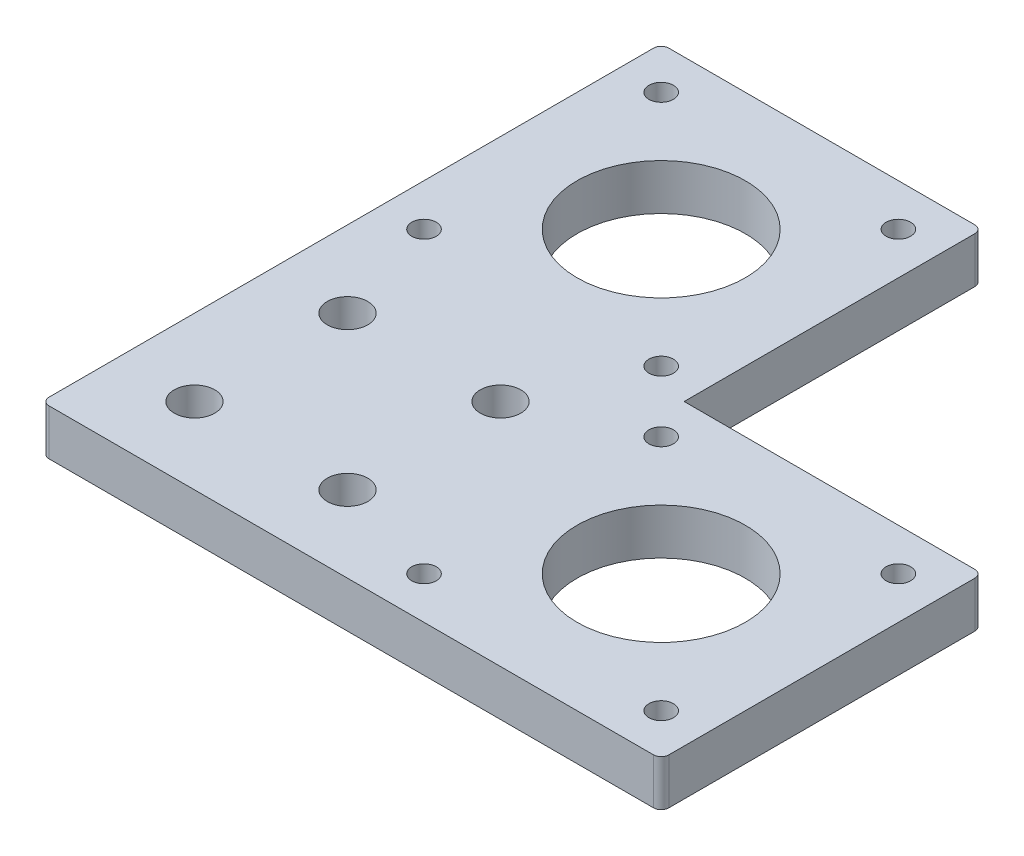
ISO-10303-21;
HEADER;
FILE_DESCRIPTION(('STEP AP214'),'2;1');
FILE_NAME('part.step','',(''),(''),'','','');
FILE_SCHEMA(('AUTOMOTIVE_DESIGN { 1 0 10303 214 1 1 1 1 }'));
ENDSEC;
DATA;
#1=APPLICATION_CONTEXT('core data for automotive mechanical design processes');
#2=APPLICATION_PROTOCOL_DEFINITION('international standard','automotive_design',2000,#1);
#3=PRODUCT_CONTEXT('',#1,'mechanical');
#4=PRODUCT('Part','Part','',(#3));
#5=PRODUCT_RELATED_PRODUCT_CATEGORY('part','',(#4));
#6=PRODUCT_DEFINITION_FORMATION('','',#4);
#7=PRODUCT_DEFINITION_CONTEXT('part definition',#1,'design');
#8=PRODUCT_DEFINITION('design','',#6,#7);
#9=PRODUCT_DEFINITION_SHAPE('','',#8);
#10=(LENGTH_UNIT() NAMED_UNIT(*) SI_UNIT(.MILLI.,.METRE.));
#11=(NAMED_UNIT(*) PLANE_ANGLE_UNIT() SI_UNIT($,.RADIAN.));
#12=(NAMED_UNIT(*) SI_UNIT($,.STERADIAN.) SOLID_ANGLE_UNIT());
#13=UNCERTAINTY_MEASURE_WITH_UNIT(LENGTH_MEASURE(1.E-05),#10,'distance_accuracy_value','');
#14=(GEOMETRIC_REPRESENTATION_CONTEXT(3) GLOBAL_UNCERTAINTY_ASSIGNED_CONTEXT((#13)) GLOBAL_UNIT_ASSIGNED_CONTEXT((#10,
#11,#12)) REPRESENTATION_CONTEXT('',''));
#15=CARTESIAN_POINT('',(0.,0.,0.));
#16=DIRECTION('',(0.,0.,1.));
#17=DIRECTION('',(1.,0.,0.));
#18=AXIS2_PLACEMENT_3D('',#15,#16,#17);
#19=CARTESIAN_POINT('',(0.,6.,-81.));
#20=DIRECTION('',(1.,0.,0.));
#21=DIRECTION('',(0.,0.,-1.));
#22=AXIS2_PLACEMENT_3D('',#19,#20,#21);
#23=PLANE('',#22);
#24=DIRECTION('',(0.,0.,1.));
#25=VECTOR('',#24,1.);
#26=CARTESIAN_POINT('',(0.,6.,-81.));
#27=LINE('',#26,#25);
#28=CARTESIAN_POINT('',(0.,6.,-80.));
#29=VERTEX_POINT('',#28);
#30=CARTESIAN_POINT('',(0.,6.,-1.));
#31=VERTEX_POINT('',#30);
#32=EDGE_CURVE('E160',#29,#31,#27,.T.);
#33=ORIENTED_EDGE('',*,*,#32,.F.);
#34=DIRECTION('',(0.,-1.,0.));
#35=VECTOR('',#34,1.);
#36=CARTESIAN_POINT('',(0.,6.,-80.));
#37=LINE('',#36,#35);
#38=CARTESIAN_POINT('',(0.,0.,-80.));
#39=VERTEX_POINT('',#38);
#40=EDGE_CURVE('E163',#29,#39,#37,.T.);
#41=ORIENTED_EDGE('',*,*,#40,.T.);
#42=DIRECTION('',(0.,0.,1.));
#43=VECTOR('',#42,1.);
#44=CARTESIAN_POINT('',(0.,0.,-81.));
#45=LINE('',#44,#43);
#46=CARTESIAN_POINT('',(0.,0.,-1.));
#47=VERTEX_POINT('',#46);
#48=EDGE_CURVE('E145',#39,#47,#45,.T.);
#49=ORIENTED_EDGE('',*,*,#48,.T.);
#50=DIRECTION('',(0.,-1.,0.));
#51=VECTOR('',#50,1.);
#52=CARTESIAN_POINT('',(0.,6.,-1.));
#53=LINE('',#52,#51);
#54=EDGE_CURVE('E137',#47,#31,#53,.F.);
#55=ORIENTED_EDGE('',*,*,#54,.T.);
#56=EDGE_LOOP('',(#33,#41,#49,#55));
#57=FACE_BOUND('',#56,.T.);
#58=ADVANCED_FACE('F38',(#57),#23,.F.);
#59=CARTESIAN_POINT('',(0.,6.,0.));
#60=DIRECTION('',(0.,0.,-1.));
#61=DIRECTION('',(-1.,0.,0.));
#62=AXIS2_PLACEMENT_3D('',#59,#60,#61);
#63=PLANE('',#62);
#64=DIRECTION('',(1.,0.,0.));
#65=VECTOR('',#64,1.);
#66=CARTESIAN_POINT('',(0.,0.,0.));
#67=LINE('',#66,#65);
#68=CARTESIAN_POINT('',(1.,0.,0.));
#69=VERTEX_POINT('',#68);
#70=CARTESIAN_POINT('',(80.,0.,0.));
#71=VERTEX_POINT('',#70);
#72=EDGE_CURVE('E148',#69,#71,#67,.T.);
#73=ORIENTED_EDGE('',*,*,#72,.T.);
#74=DIRECTION('',(0.,-1.,0.));
#75=VECTOR('',#74,1.);
#76=CARTESIAN_POINT('',(80.,6.,0.));
#77=LINE('',#76,#75);
#78=CARTESIAN_POINT('',(80.,6.,0.));
#79=VERTEX_POINT('',#78);
#80=EDGE_CURVE('E11',#71,#79,#77,.F.);
#81=ORIENTED_EDGE('',*,*,#80,.T.);
#82=DIRECTION('',(1.,0.,0.));
#83=VECTOR('',#82,1.);
#84=CARTESIAN_POINT('',(0.,6.,0.));
#85=LINE('',#84,#83);
#86=CARTESIAN_POINT('',(1.,6.,0.));
#87=VERTEX_POINT('',#86);
#88=EDGE_CURVE('E205',#87,#79,#85,.T.);
#89=ORIENTED_EDGE('',*,*,#88,.F.);
#90=DIRECTION('',(0.,-1.,0.));
#91=VECTOR('',#90,1.);
#92=CARTESIAN_POINT('',(1.,6.,0.));
#93=LINE('',#92,#91);
#94=EDGE_CURVE('E46',#87,#69,#93,.T.);
#95=ORIENTED_EDGE('',*,*,#94,.T.);
#96=EDGE_LOOP('',(#73,#81,#89,#95));
#97=FACE_BOUND('',#96,.T.);
#98=ADVANCED_FACE('F202',(#97),#63,.F.);
#99=CARTESIAN_POINT('',(81.,6.,0.));
#100=DIRECTION('',(-1.,0.,0.));
#101=DIRECTION('',(0.,0.,1.));
#102=AXIS2_PLACEMENT_3D('',#99,#100,#101);
#103=PLANE('',#102);
#104=DIRECTION('',(0.,0.,-1.));
#105=VECTOR('',#104,1.);
#106=CARTESIAN_POINT('',(81.,0.,0.));
#107=LINE('',#106,#105);
#108=CARTESIAN_POINT('',(81.,0.,-1.00000000000001));
#109=VERTEX_POINT('',#108);
#110=CARTESIAN_POINT('',(81.,0.,-41.));
#111=VERTEX_POINT('',#110);
#112=EDGE_CURVE('E152',#109,#111,#107,.T.);
#113=ORIENTED_EDGE('',*,*,#112,.T.);
#114=DIRECTION('',(0.,-1.,0.));
#115=VECTOR('',#114,1.);
#116=CARTESIAN_POINT('',(81.,6.,-41.));
#117=LINE('',#116,#115);
#118=CARTESIAN_POINT('',(81.,6.,-41.));
#119=VERTEX_POINT('',#118);
#120=EDGE_CURVE('E196',#111,#119,#117,.F.);
#121=ORIENTED_EDGE('',*,*,#120,.T.);
#122=DIRECTION('',(0.,0.,-1.));
#123=VECTOR('',#122,1.);
#124=CARTESIAN_POINT('',(81.,6.,0.));
#125=LINE('',#124,#123);
#126=CARTESIAN_POINT('',(81.,6.,-1.00000000000001));
#127=VERTEX_POINT('',#126);
#128=EDGE_CURVE('E129',#127,#119,#125,.T.);
#129=ORIENTED_EDGE('',*,*,#128,.F.);
#130=DIRECTION('',(0.,-1.,0.));
#131=VECTOR('',#130,1.);
#132=CARTESIAN_POINT('',(81.,6.,-1.00000000000001));
#133=LINE('',#132,#131);
#134=EDGE_CURVE('E193',#127,#109,#133,.T.);
#135=ORIENTED_EDGE('',*,*,#134,.T.);
#136=EDGE_LOOP('',(#113,#121,#129,#135));
#137=FACE_BOUND('',#136,.T.);
#138=ADVANCED_FACE('F218',(#137),#103,.F.);
#139=CARTESIAN_POINT('',(81.,6.,-42.));
#140=DIRECTION('',(0.,0.,1.));
#141=DIRECTION('',(1.,0.,0.));
#142=AXIS2_PLACEMENT_3D('',#139,#140,#141);
#143=PLANE('',#142);
#144=DIRECTION('',(-1.,0.,0.));
#145=VECTOR('',#144,1.);
#146=CARTESIAN_POINT('',(81.,6.,-42.));
#147=LINE('',#146,#145);
#148=CARTESIAN_POINT('',(80.,6.,-42.));
#149=VERTEX_POINT('',#148);
#150=CARTESIAN_POINT('',(42.,6.,-42.));
#151=VERTEX_POINT('',#150);
#152=EDGE_CURVE('E120',#149,#151,#147,.T.);
#153=ORIENTED_EDGE('',*,*,#152,.F.);
#154=DIRECTION('',(0.,-1.,0.));
#155=VECTOR('',#154,1.);
#156=CARTESIAN_POINT('',(80.,6.,-42.));
#157=LINE('',#156,#155);
#158=CARTESIAN_POINT('',(80.,0.,-42.));
#159=VERTEX_POINT('',#158);
#160=EDGE_CURVE('E191',#149,#159,#157,.T.);
#161=ORIENTED_EDGE('',*,*,#160,.T.);
#162=DIRECTION('',(-1.,0.,0.));
#163=VECTOR('',#162,1.);
#164=CARTESIAN_POINT('',(81.,0.,-42.));
#165=LINE('',#164,#163);
#166=CARTESIAN_POINT('',(42.,0.,-42.));
#167=VERTEX_POINT('',#166);
#168=EDGE_CURVE('E135',#159,#167,#165,.T.);
#169=ORIENTED_EDGE('',*,*,#168,.T.);
#170=DIRECTION('',(0.,-1.,0.));
#171=VECTOR('',#170,1.);
#172=CARTESIAN_POINT('',(42.,6.,-42.));
#173=LINE('',#172,#171);
#174=EDGE_CURVE('E132',#151,#167,#173,.T.);
#175=ORIENTED_EDGE('',*,*,#174,.F.);
#176=EDGE_LOOP('',(#153,#161,#169,#175));
#177=FACE_BOUND('',#176,.T.);
#178=ADVANCED_FACE('F133',(#177),#143,.F.);
#179=CARTESIAN_POINT('',(42.,6.,-42.));
#180=DIRECTION('',(-1.,0.,0.));
#181=DIRECTION('',(0.,0.,1.));
#182=AXIS2_PLACEMENT_3D('',#179,#180,#181);
#183=PLANE('',#182);
#184=DIRECTION('',(0.,0.,-1.));
#185=VECTOR('',#184,1.);
#186=CARTESIAN_POINT('',(42.,0.,-42.));
#187=LINE('',#186,#185);
#188=CARTESIAN_POINT('',(42.,0.,-80.));
#189=VERTEX_POINT('',#188);
#190=EDGE_CURVE('E156',#167,#189,#187,.T.);
#191=ORIENTED_EDGE('',*,*,#190,.T.);
#192=DIRECTION('',(0.,-1.,0.));
#193=VECTOR('',#192,1.);
#194=CARTESIAN_POINT('',(42.,6.,-80.));
#195=LINE('',#194,#193);
#196=CARTESIAN_POINT('',(42.,6.,-80.));
#197=VERTEX_POINT('',#196);
#198=EDGE_CURVE('E53',#189,#197,#195,.F.);
#199=ORIENTED_EDGE('',*,*,#198,.T.);
#200=DIRECTION('',(0.,0.,-1.));
#201=VECTOR('',#200,1.);
#202=CARTESIAN_POINT('',(42.,6.,-42.));
#203=LINE('',#202,#201);
#204=EDGE_CURVE('E124',#151,#197,#203,.T.);
#205=ORIENTED_EDGE('',*,*,#204,.F.);
#206=ORIENTED_EDGE('',*,*,#174,.T.);
#207=EDGE_LOOP('',(#191,#199,#205,#206));
#208=FACE_BOUND('',#207,.T.);
#209=ADVANCED_FACE('F140',(#208),#183,.F.);
#210=CARTESIAN_POINT('',(42.,6.,-81.));
#211=DIRECTION('',(0.,0.,1.));
#212=DIRECTION('',(1.,0.,0.));
#213=AXIS2_PLACEMENT_3D('',#210,#211,#212);
#214=PLANE('',#213);
#215=DIRECTION('',(-1.,0.,0.));
#216=VECTOR('',#215,1.);
#217=CARTESIAN_POINT('',(42.,0.,-81.));
#218=LINE('',#217,#216);
#219=CARTESIAN_POINT('',(41.,0.,-81.));
#220=VERTEX_POINT('',#219);
#221=CARTESIAN_POINT('',(1.00000000000001,0.,-81.));
#222=VERTEX_POINT('',#221);
#223=EDGE_CURVE('E158',#220,#222,#218,.T.);
#224=ORIENTED_EDGE('',*,*,#223,.T.);
#225=DIRECTION('',(0.,-1.,0.));
#226=VECTOR('',#225,1.);
#227=CARTESIAN_POINT('',(1.,6.,-81.));
#228=LINE('',#227,#226);
#229=CARTESIAN_POINT('',(1.00000000000001,6.,-81.));
#230=VERTEX_POINT('',#229);
#231=EDGE_CURVE('E179',#222,#230,#228,.F.);
#232=ORIENTED_EDGE('',*,*,#231,.T.);
#233=DIRECTION('',(-1.,0.,0.));
#234=VECTOR('',#233,1.);
#235=CARTESIAN_POINT('',(42.,6.,-81.));
#236=LINE('',#235,#234);
#237=CARTESIAN_POINT('',(41.,6.,-81.));
#238=VERTEX_POINT('',#237);
#239=EDGE_CURVE('E138',#238,#230,#236,.T.);
#240=ORIENTED_EDGE('',*,*,#239,.F.);
#241=DIRECTION('',(0.,-1.,0.));
#242=VECTOR('',#241,1.);
#243=CARTESIAN_POINT('',(41.,6.,-81.));
#244=LINE('',#243,#242);
#245=EDGE_CURVE('E176',#238,#220,#244,.T.);
#246=ORIENTED_EDGE('',*,*,#245,.T.);
#247=EDGE_LOOP('',(#224,#232,#240,#246));
#248=FACE_BOUND('',#247,.T.);
#249=ADVANCED_FACE('F312',(#248),#214,.F.);
#250=CARTESIAN_POINT('',(0.,6.,0.));
#251=DIRECTION('',(0.,1.,0.));
#252=DIRECTION('',(0.,0.,1.));
#253=AXIS2_PLACEMENT_3D('',#250,#251,#252);
#254=PLANE('',#253);
#255=CARTESIAN_POINT('',(60.,6.,-21.));
#256=DIRECTION('',(0.,1.,0.));
#257=DIRECTION('',(0.,0.,1.));
#258=AXIS2_PLACEMENT_3D('',#255,#256,#257);
#259=CIRCLE('',#258,11.);
#260=CARTESIAN_POINT('',(60.,6.,-10.));
#261=VERTEX_POINT('',#260);
#262=EDGE_CURVE('E304',#261,#261,#259,.T.);
#263=ORIENTED_EDGE('',*,*,#262,.F.);
#264=EDGE_LOOP('',(#263));
#265=FACE_BOUND('',#264,.T.);
#266=CARTESIAN_POINT('',(21.,6.,-60.));
#267=DIRECTION('',(0.,1.,0.));
#268=DIRECTION('',(0.,0.,1.));
#269=AXIS2_PLACEMENT_3D('',#266,#267,#268);
#270=CIRCLE('',#269,11.);
#271=CARTESIAN_POINT('',(21.,6.,-49.));
#272=VERTEX_POINT('',#271);
#273=EDGE_CURVE('E298',#272,#272,#270,.T.);
#274=ORIENTED_EDGE('',*,*,#273,.F.);
#275=EDGE_LOOP('',(#274));
#276=FACE_BOUND('',#275,.T.);
#277=CARTESIAN_POINT('',(5.50000000000001,6.,-44.5));
#278=DIRECTION('',(0.,1.,0.));
#279=DIRECTION('',(0.,0.,1.));
#280=AXIS2_PLACEMENT_3D('',#277,#278,#279);
#281=CIRCLE('',#280,1.6);
#282=CARTESIAN_POINT('',(5.50000000000001,6.,-42.9));
#283=VERTEX_POINT('',#282);
#284=EDGE_CURVE('E292',#283,#283,#281,.T.);
#285=ORIENTED_EDGE('',*,*,#284,.F.);
#286=EDGE_LOOP('',(#285));
#287=FACE_BOUND('',#286,.T.);
#288=CARTESIAN_POINT('',(36.5,6.,-44.5));
#289=DIRECTION('',(0.,1.,0.));
#290=DIRECTION('',(0.,0.,1.));
#291=AXIS2_PLACEMENT_3D('',#288,#289,#290);
#292=CIRCLE('',#291,1.6);
#293=CARTESIAN_POINT('',(36.5,6.,-42.9));
#294=VERTEX_POINT('',#293);
#295=EDGE_CURVE('E286',#294,#294,#292,.T.);
#296=ORIENTED_EDGE('',*,*,#295,.F.);
#297=EDGE_LOOP('',(#296));
#298=FACE_BOUND('',#297,.T.);
#299=CARTESIAN_POINT('',(36.5,6.,-75.5));
#300=DIRECTION('',(0.,1.,0.));
#301=DIRECTION('',(0.,0.,1.));
#302=AXIS2_PLACEMENT_3D('',#299,#300,#301);
#303=CIRCLE('',#302,1.6);
#304=CARTESIAN_POINT('',(36.5,6.,-73.9));
#305=VERTEX_POINT('',#304);
#306=EDGE_CURVE('E280',#305,#305,#303,.T.);
#307=ORIENTED_EDGE('',*,*,#306,.F.);
#308=EDGE_LOOP('',(#307));
#309=FACE_BOUND('',#308,.T.);
#310=CARTESIAN_POINT('',(5.5,6.,-75.5));
#311=DIRECTION('',(0.,1.,0.));
#312=DIRECTION('',(0.,0.,1.));
#313=AXIS2_PLACEMENT_3D('',#310,#311,#312);
#314=CIRCLE('',#313,1.6);
#315=CARTESIAN_POINT('',(5.5,6.,-73.9));
#316=VERTEX_POINT('',#315);
#317=EDGE_CURVE('E274',#316,#316,#314,.T.);
#318=ORIENTED_EDGE('',*,*,#317,.F.);
#319=EDGE_LOOP('',(#318));
#320=FACE_BOUND('',#319,.T.);
#321=CARTESIAN_POINT('',(44.5,6.,-36.5));
#322=DIRECTION('',(0.,1.,0.));
#323=DIRECTION('',(0.,0.,1.));
#324=AXIS2_PLACEMENT_3D('',#321,#322,#323);
#325=CIRCLE('',#324,1.6);
#326=CARTESIAN_POINT('',(44.5,6.,-34.9));
#327=VERTEX_POINT('',#326);
#328=EDGE_CURVE('E268',#327,#327,#325,.T.);
#329=ORIENTED_EDGE('',*,*,#328,.F.);
#330=EDGE_LOOP('',(#329));
#331=FACE_BOUND('',#330,.T.);
#332=CARTESIAN_POINT('',(44.5,6.,-5.50000000000001));
#333=DIRECTION('',(0.,1.,0.));
#334=DIRECTION('',(0.,0.,1.));
#335=AXIS2_PLACEMENT_3D('',#332,#333,#334);
#336=CIRCLE('',#335,1.6);
#337=CARTESIAN_POINT('',(44.5,6.,-3.90000000000001));
#338=VERTEX_POINT('',#337);
#339=EDGE_CURVE('E262',#338,#338,#336,.T.);
#340=ORIENTED_EDGE('',*,*,#339,.F.);
#341=EDGE_LOOP('',(#340));
#342=FACE_BOUND('',#341,.T.);
#343=CARTESIAN_POINT('',(75.5,6.,-5.50000000000001));
#344=DIRECTION('',(0.,1.,0.));
#345=DIRECTION('',(0.,0.,1.));
#346=AXIS2_PLACEMENT_3D('',#343,#344,#345);
#347=CIRCLE('',#346,1.6);
#348=CARTESIAN_POINT('',(75.5,6.,-3.90000000000001));
#349=VERTEX_POINT('',#348);
#350=EDGE_CURVE('E256',#349,#349,#347,.T.);
#351=ORIENTED_EDGE('',*,*,#350,.F.);
#352=EDGE_LOOP('',(#351));
#353=FACE_BOUND('',#352,.T.);
#354=CARTESIAN_POINT('',(75.5,6.,-36.5));
#355=DIRECTION('',(0.,1.,0.));
#356=DIRECTION('',(0.,0.,1.));
#357=AXIS2_PLACEMENT_3D('',#354,#355,#356);
#358=CIRCLE('',#357,1.6);
#359=CARTESIAN_POINT('',(75.5,6.,-34.9));
#360=VERTEX_POINT('',#359);
#361=EDGE_CURVE('E250',#360,#360,#358,.T.);
#362=ORIENTED_EDGE('',*,*,#361,.F.);
#363=EDGE_LOOP('',(#362));
#364=FACE_BOUND('',#363,.T.);
#365=CARTESIAN_POINT('',(9.99999999999999,6.,-30.));
#366=DIRECTION('',(0.,1.,0.));
#367=DIRECTION('',(0.,0.,1.));
#368=AXIS2_PLACEMENT_3D('',#365,#366,#367);
#369=CIRCLE('',#368,2.65);
#370=CARTESIAN_POINT('',(9.99999999999999,6.,-27.35));
#371=VERTEX_POINT('',#370);
#372=EDGE_CURVE('E244',#371,#371,#369,.T.);
#373=ORIENTED_EDGE('',*,*,#372,.F.);
#374=EDGE_LOOP('',(#373));
#375=FACE_BOUND('',#374,.T.);
#376=CARTESIAN_POINT('',(30.,6.,-30.));
#377=DIRECTION('',(0.,1.,0.));
#378=DIRECTION('',(0.,0.,1.));
#379=AXIS2_PLACEMENT_3D('',#376,#377,#378);
#380=CIRCLE('',#379,2.65);
#381=CARTESIAN_POINT('',(30.,6.,-27.35));
#382=VERTEX_POINT('',#381);
#383=EDGE_CURVE('E238',#382,#382,#380,.T.);
#384=ORIENTED_EDGE('',*,*,#383,.F.);
#385=EDGE_LOOP('',(#384));
#386=FACE_BOUND('',#385,.T.);
#387=CARTESIAN_POINT('',(30.,6.,-10.));
#388=DIRECTION('',(0.,1.,0.));
#389=DIRECTION('',(0.,0.,1.));
#390=AXIS2_PLACEMENT_3D('',#387,#388,#389);
#391=CIRCLE('',#390,2.65);
#392=CARTESIAN_POINT('',(30.,6.,-7.35000000000001));
#393=VERTEX_POINT('',#392);
#394=EDGE_CURVE('E232',#393,#393,#391,.T.);
#395=ORIENTED_EDGE('',*,*,#394,.F.);
#396=EDGE_LOOP('',(#395));
#397=FACE_BOUND('',#396,.T.);
#398=CARTESIAN_POINT('',(9.99999999999999,6.,-10.));
#399=DIRECTION('',(0.,1.,0.));
#400=DIRECTION('',(0.,0.,1.));
#401=AXIS2_PLACEMENT_3D('',#398,#399,#400);
#402=CIRCLE('',#401,2.65);
#403=CARTESIAN_POINT('',(9.99999999999999,6.,-7.35));
#404=VERTEX_POINT('',#403);
#405=EDGE_CURVE('E226',#404,#404,#402,.T.);
#406=ORIENTED_EDGE('',*,*,#405,.F.);
#407=EDGE_LOOP('',(#406));
#408=FACE_BOUND('',#407,.T.);
#409=ORIENTED_EDGE('',*,*,#239,.T.);
#410=CARTESIAN_POINT('',(1.,6.,-80.));
#411=DIRECTION('',(0.,1.,0.));
#412=DIRECTION('',(0.,0.,1.));
#413=AXIS2_PLACEMENT_3D('',#410,#411,#412);
#414=CIRCLE('',#413,1.);
#415=EDGE_CURVE('E188',#230,#29,#414,.T.);
#416=ORIENTED_EDGE('',*,*,#415,.T.);
#417=ORIENTED_EDGE('',*,*,#32,.T.);
#418=CARTESIAN_POINT('',(1.,6.,-1.));
#419=DIRECTION('',(0.,1.,0.));
#420=DIRECTION('',(0.,0.,1.));
#421=AXIS2_PLACEMENT_3D('',#418,#419,#420);
#422=CIRCLE('',#421,1.);
#423=EDGE_CURVE('E181',#31,#87,#422,.T.);
#424=ORIENTED_EDGE('',*,*,#423,.T.);
#425=ORIENTED_EDGE('',*,*,#88,.T.);
#426=CARTESIAN_POINT('',(80.,6.,-1.00000000000001));
#427=DIRECTION('',(0.,1.,0.));
#428=DIRECTION('',(0.,0.,1.));
#429=AXIS2_PLACEMENT_3D('',#426,#427,#428);
#430=CIRCLE('',#429,1.);
#431=EDGE_CURVE('E183',#79,#127,#430,.T.);
#432=ORIENTED_EDGE('',*,*,#431,.T.);
#433=ORIENTED_EDGE('',*,*,#128,.T.);
#434=CARTESIAN_POINT('',(80.,6.,-41.));
#435=DIRECTION('',(0.,1.,0.));
#436=DIRECTION('',(0.,0.,1.));
#437=AXIS2_PLACEMENT_3D('',#434,#435,#436);
#438=CIRCLE('',#437,1.);
#439=EDGE_CURVE('E61',#119,#149,#438,.T.);
#440=ORIENTED_EDGE('',*,*,#439,.T.);
#441=ORIENTED_EDGE('',*,*,#152,.T.);
#442=ORIENTED_EDGE('',*,*,#204,.T.);
#443=CARTESIAN_POINT('',(41.,6.,-80.));
#444=DIRECTION('',(0.,1.,0.));
#445=DIRECTION('',(0.,0.,1.));
#446=AXIS2_PLACEMENT_3D('',#443,#444,#445);
#447=CIRCLE('',#446,1.);
#448=EDGE_CURVE('E186',#197,#238,#447,.T.);
#449=ORIENTED_EDGE('',*,*,#448,.T.);
#450=EDGE_LOOP('',(#409,#416,#417,#424,#425,#432,#433,#440,#441,#442,#449));
#451=FACE_BOUND('',#450,.T.);
#452=ADVANCED_FACE('F123',(#265,#276,#287,#298,#309,#320,#331,#342,#353,#364,#375,#386,#397,
#408,#451),#254,.T.);
#453=CARTESIAN_POINT('',(0.,0.,0.));
#454=DIRECTION('',(0.,1.,0.));
#455=DIRECTION('',(0.,0.,1.));
#456=AXIS2_PLACEMENT_3D('',#453,#454,#455);
#457=PLANE('',#456);
#458=CARTESIAN_POINT('',(60.,0.,-21.));
#459=DIRECTION('',(0.,1.,0.));
#460=DIRECTION('',(0.,0.,1.));
#461=AXIS2_PLACEMENT_3D('',#458,#459,#460);
#462=CIRCLE('',#461,11.);
#463=CARTESIAN_POINT('',(60.,0.,-10.));
#464=VERTEX_POINT('',#463);
#465=EDGE_CURVE('E301',#464,#464,#462,.T.);
#466=ORIENTED_EDGE('',*,*,#465,.T.);
#467=EDGE_LOOP('',(#466));
#468=FACE_BOUND('',#467,.T.);
#469=CARTESIAN_POINT('',(21.,0.,-60.));
#470=DIRECTION('',(0.,1.,0.));
#471=DIRECTION('',(0.,0.,1.));
#472=AXIS2_PLACEMENT_3D('',#469,#470,#471);
#473=CIRCLE('',#472,11.);
#474=CARTESIAN_POINT('',(21.,0.,-49.));
#475=VERTEX_POINT('',#474);
#476=EDGE_CURVE('E295',#475,#475,#473,.T.);
#477=ORIENTED_EDGE('',*,*,#476,.T.);
#478=EDGE_LOOP('',(#477));
#479=FACE_BOUND('',#478,.T.);
#480=CARTESIAN_POINT('',(5.50000000000001,0.,-44.5));
#481=DIRECTION('',(0.,1.,0.));
#482=DIRECTION('',(0.,0.,1.));
#483=AXIS2_PLACEMENT_3D('',#480,#481,#482);
#484=CIRCLE('',#483,1.6);
#485=CARTESIAN_POINT('',(5.50000000000001,0.,-42.9));
#486=VERTEX_POINT('',#485);
#487=EDGE_CURVE('E289',#486,#486,#484,.T.);
#488=ORIENTED_EDGE('',*,*,#487,.T.);
#489=EDGE_LOOP('',(#488));
#490=FACE_BOUND('',#489,.T.);
#491=CARTESIAN_POINT('',(36.5,0.,-44.5));
#492=DIRECTION('',(0.,1.,0.));
#493=DIRECTION('',(0.,0.,1.));
#494=AXIS2_PLACEMENT_3D('',#491,#492,#493);
#495=CIRCLE('',#494,1.6);
#496=CARTESIAN_POINT('',(36.5,0.,-42.9));
#497=VERTEX_POINT('',#496);
#498=EDGE_CURVE('E283',#497,#497,#495,.T.);
#499=ORIENTED_EDGE('',*,*,#498,.T.);
#500=EDGE_LOOP('',(#499));
#501=FACE_BOUND('',#500,.T.);
#502=CARTESIAN_POINT('',(36.5,0.,-75.5));
#503=DIRECTION('',(0.,1.,0.));
#504=DIRECTION('',(0.,0.,1.));
#505=AXIS2_PLACEMENT_3D('',#502,#503,#504);
#506=CIRCLE('',#505,1.6);
#507=CARTESIAN_POINT('',(36.5,0.,-73.9));
#508=VERTEX_POINT('',#507);
#509=EDGE_CURVE('E277',#508,#508,#506,.T.);
#510=ORIENTED_EDGE('',*,*,#509,.T.);
#511=EDGE_LOOP('',(#510));
#512=FACE_BOUND('',#511,.T.);
#513=CARTESIAN_POINT('',(5.5,0.,-75.5));
#514=DIRECTION('',(0.,1.,0.));
#515=DIRECTION('',(0.,0.,1.));
#516=AXIS2_PLACEMENT_3D('',#513,#514,#515);
#517=CIRCLE('',#516,1.6);
#518=CARTESIAN_POINT('',(5.5,0.,-73.9));
#519=VERTEX_POINT('',#518);
#520=EDGE_CURVE('E271',#519,#519,#517,.T.);
#521=ORIENTED_EDGE('',*,*,#520,.T.);
#522=EDGE_LOOP('',(#521));
#523=FACE_BOUND('',#522,.T.);
#524=CARTESIAN_POINT('',(44.5,0.,-36.5));
#525=DIRECTION('',(0.,1.,0.));
#526=DIRECTION('',(0.,0.,1.));
#527=AXIS2_PLACEMENT_3D('',#524,#525,#526);
#528=CIRCLE('',#527,1.6);
#529=CARTESIAN_POINT('',(44.5,0.,-34.9));
#530=VERTEX_POINT('',#529);
#531=EDGE_CURVE('E265',#530,#530,#528,.T.);
#532=ORIENTED_EDGE('',*,*,#531,.T.);
#533=EDGE_LOOP('',(#532));
#534=FACE_BOUND('',#533,.T.);
#535=CARTESIAN_POINT('',(44.5,0.,-5.50000000000001));
#536=DIRECTION('',(0.,1.,0.));
#537=DIRECTION('',(0.,0.,1.));
#538=AXIS2_PLACEMENT_3D('',#535,#536,#537);
#539=CIRCLE('',#538,1.6);
#540=CARTESIAN_POINT('',(44.5,0.,-3.90000000000001));
#541=VERTEX_POINT('',#540);
#542=EDGE_CURVE('E259',#541,#541,#539,.T.);
#543=ORIENTED_EDGE('',*,*,#542,.T.);
#544=EDGE_LOOP('',(#543));
#545=FACE_BOUND('',#544,.T.);
#546=CARTESIAN_POINT('',(75.5,0.,-5.50000000000001));
#547=DIRECTION('',(0.,1.,0.));
#548=DIRECTION('',(0.,0.,1.));
#549=AXIS2_PLACEMENT_3D('',#546,#547,#548);
#550=CIRCLE('',#549,1.6);
#551=CARTESIAN_POINT('',(75.5,0.,-3.90000000000001));
#552=VERTEX_POINT('',#551);
#553=EDGE_CURVE('E253',#552,#552,#550,.T.);
#554=ORIENTED_EDGE('',*,*,#553,.T.);
#555=EDGE_LOOP('',(#554));
#556=FACE_BOUND('',#555,.T.);
#557=CARTESIAN_POINT('',(75.5,0.,-36.5));
#558=DIRECTION('',(0.,1.,0.));
#559=DIRECTION('',(0.,0.,1.));
#560=AXIS2_PLACEMENT_3D('',#557,#558,#559);
#561=CIRCLE('',#560,1.6);
#562=CARTESIAN_POINT('',(75.5,0.,-34.9));
#563=VERTEX_POINT('',#562);
#564=EDGE_CURVE('E247',#563,#563,#561,.T.);
#565=ORIENTED_EDGE('',*,*,#564,.T.);
#566=EDGE_LOOP('',(#565));
#567=FACE_BOUND('',#566,.T.);
#568=CARTESIAN_POINT('',(9.99999999999999,0.,-30.));
#569=DIRECTION('',(0.,1.,0.));
#570=DIRECTION('',(0.,0.,1.));
#571=AXIS2_PLACEMENT_3D('',#568,#569,#570);
#572=CIRCLE('',#571,2.65);
#573=CARTESIAN_POINT('',(9.99999999999999,0.,-27.35));
#574=VERTEX_POINT('',#573);
#575=EDGE_CURVE('E241',#574,#574,#572,.T.);
#576=ORIENTED_EDGE('',*,*,#575,.T.);
#577=EDGE_LOOP('',(#576));
#578=FACE_BOUND('',#577,.T.);
#579=CARTESIAN_POINT('',(30.,0.,-30.));
#580=DIRECTION('',(0.,1.,0.));
#581=DIRECTION('',(0.,0.,1.));
#582=AXIS2_PLACEMENT_3D('',#579,#580,#581);
#583=CIRCLE('',#582,2.65);
#584=CARTESIAN_POINT('',(30.,0.,-27.35));
#585=VERTEX_POINT('',#584);
#586=EDGE_CURVE('E235',#585,#585,#583,.T.);
#587=ORIENTED_EDGE('',*,*,#586,.T.);
#588=EDGE_LOOP('',(#587));
#589=FACE_BOUND('',#588,.T.);
#590=CARTESIAN_POINT('',(30.,0.,-10.));
#591=DIRECTION('',(0.,1.,0.));
#592=DIRECTION('',(0.,0.,1.));
#593=AXIS2_PLACEMENT_3D('',#590,#591,#592);
#594=CIRCLE('',#593,2.65);
#595=CARTESIAN_POINT('',(30.,0.,-7.35000000000001));
#596=VERTEX_POINT('',#595);
#597=EDGE_CURVE('E229',#596,#596,#594,.T.);
#598=ORIENTED_EDGE('',*,*,#597,.T.);
#599=EDGE_LOOP('',(#598));
#600=FACE_BOUND('',#599,.T.);
#601=CARTESIAN_POINT('',(9.99999999999999,0.,-10.));
#602=DIRECTION('',(0.,1.,0.));
#603=DIRECTION('',(0.,0.,1.));
#604=AXIS2_PLACEMENT_3D('',#601,#602,#603);
#605=CIRCLE('',#604,2.65);
#606=CARTESIAN_POINT('',(9.99999999999999,0.,-7.35));
#607=VERTEX_POINT('',#606);
#608=EDGE_CURVE('E149',#607,#607,#605,.T.);
#609=ORIENTED_EDGE('',*,*,#608,.T.);
#610=EDGE_LOOP('',(#609));
#611=FACE_BOUND('',#610,.T.);
#612=ORIENTED_EDGE('',*,*,#48,.F.);
#613=CARTESIAN_POINT('',(1.,0.,-80.));
#614=DIRECTION('',(0.,1.,0.));
#615=DIRECTION('',(0.,0.,1.));
#616=AXIS2_PLACEMENT_3D('',#613,#614,#615);
#617=CIRCLE('',#616,1.);
#618=EDGE_CURVE('E174',#39,#222,#617,.F.);
#619=ORIENTED_EDGE('',*,*,#618,.T.);
#620=ORIENTED_EDGE('',*,*,#223,.F.);
#621=CARTESIAN_POINT('',(41.,0.,-80.));
#622=DIRECTION('',(0.,1.,0.));
#623=DIRECTION('',(0.,0.,1.));
#624=AXIS2_PLACEMENT_3D('',#621,#622,#623);
#625=CIRCLE('',#624,1.);
#626=EDGE_CURVE('E172',#220,#189,#625,.F.);
#627=ORIENTED_EDGE('',*,*,#626,.T.);
#628=ORIENTED_EDGE('',*,*,#190,.F.);
#629=ORIENTED_EDGE('',*,*,#168,.F.);
#630=CARTESIAN_POINT('',(80.,0.,-41.));
#631=DIRECTION('',(0.,1.,0.));
#632=DIRECTION('',(0.,0.,1.));
#633=AXIS2_PLACEMENT_3D('',#630,#631,#632);
#634=CIRCLE('',#633,1.);
#635=EDGE_CURVE('E170',#159,#111,#634,.F.);
#636=ORIENTED_EDGE('',*,*,#635,.T.);
#637=ORIENTED_EDGE('',*,*,#112,.F.);
#638=CARTESIAN_POINT('',(80.,0.,-1.00000000000001));
#639=DIRECTION('',(0.,1.,0.));
#640=DIRECTION('',(0.,0.,1.));
#641=AXIS2_PLACEMENT_3D('',#638,#639,#640);
#642=CIRCLE('',#641,1.);
#643=EDGE_CURVE('E168',#109,#71,#642,.F.);
#644=ORIENTED_EDGE('',*,*,#643,.T.);
#645=ORIENTED_EDGE('',*,*,#72,.F.);
#646=CARTESIAN_POINT('',(1.,0.,-1.));
#647=DIRECTION('',(0.,1.,0.));
#648=DIRECTION('',(0.,0.,1.));
#649=AXIS2_PLACEMENT_3D('',#646,#647,#648);
#650=CIRCLE('',#649,1.);
#651=EDGE_CURVE('E166',#69,#47,#650,.F.);
#652=ORIENTED_EDGE('',*,*,#651,.T.);
#653=EDGE_LOOP('',(#612,#619,#620,#627,#628,#629,#636,#637,#644,#645,#652));
#654=FACE_BOUND('',#653,.T.);
#655=ADVANCED_FACE('F210',(#468,#479,#490,#501,#512,#523,#534,#545,#556,#567,#578,#589,#600,
#611,#654),#457,.F.);
#656=CARTESIAN_POINT('',(9.99999999999999,6.,-10.));
#657=DIRECTION('',(0.,1.,0.));
#658=DIRECTION('',(0.,0.,1.));
#659=AXIS2_PLACEMENT_3D('',#656,#657,#658);
#660=CYLINDRICAL_SURFACE('',#659,2.65);
#661=ORIENTED_EDGE('',*,*,#608,.F.);
#662=EDGE_LOOP('',(#661));
#663=FACE_BOUND('',#662,.T.);
#664=ORIENTED_EDGE('',*,*,#405,.T.);
#665=EDGE_LOOP('',(#664));
#666=FACE_BOUND('',#665,.T.);
#667=ADVANCED_FACE('F340',(#663,#666),#660,.F.);
#668=CARTESIAN_POINT('',(30.,6.,-10.));
#669=DIRECTION('',(0.,1.,0.));
#670=DIRECTION('',(0.,0.,1.));
#671=AXIS2_PLACEMENT_3D('',#668,#669,#670);
#672=CYLINDRICAL_SURFACE('',#671,2.65);
#673=ORIENTED_EDGE('',*,*,#597,.F.);
#674=EDGE_LOOP('',(#673));
#675=FACE_BOUND('',#674,.T.);
#676=ORIENTED_EDGE('',*,*,#394,.T.);
#677=EDGE_LOOP('',(#676));
#678=FACE_BOUND('',#677,.T.);
#679=ADVANCED_FACE('F342',(#675,#678),#672,.F.);
#680=CARTESIAN_POINT('',(30.,6.,-30.));
#681=DIRECTION('',(0.,1.,0.));
#682=DIRECTION('',(0.,0.,1.));
#683=AXIS2_PLACEMENT_3D('',#680,#681,#682);
#684=CYLINDRICAL_SURFACE('',#683,2.65);
#685=ORIENTED_EDGE('',*,*,#586,.F.);
#686=EDGE_LOOP('',(#685));
#687=FACE_BOUND('',#686,.T.);
#688=ORIENTED_EDGE('',*,*,#383,.T.);
#689=EDGE_LOOP('',(#688));
#690=FACE_BOUND('',#689,.T.);
#691=ADVANCED_FACE('F349',(#687,#690),#684,.F.);
#692=CARTESIAN_POINT('',(9.99999999999999,6.,-30.));
#693=DIRECTION('',(0.,1.,0.));
#694=DIRECTION('',(0.,0.,1.));
#695=AXIS2_PLACEMENT_3D('',#692,#693,#694);
#696=CYLINDRICAL_SURFACE('',#695,2.65);
#697=ORIENTED_EDGE('',*,*,#575,.F.);
#698=EDGE_LOOP('',(#697));
#699=FACE_BOUND('',#698,.T.);
#700=ORIENTED_EDGE('',*,*,#372,.T.);
#701=EDGE_LOOP('',(#700));
#702=FACE_BOUND('',#701,.T.);
#703=ADVANCED_FACE('F534',(#699,#702),#696,.F.);
#704=CARTESIAN_POINT('',(75.5,6.,-36.5));
#705=DIRECTION('',(0.,1.,0.));
#706=DIRECTION('',(0.,0.,1.));
#707=AXIS2_PLACEMENT_3D('',#704,#705,#706);
#708=CYLINDRICAL_SURFACE('',#707,1.6);
#709=ORIENTED_EDGE('',*,*,#564,.F.);
#710=EDGE_LOOP('',(#709));
#711=FACE_BOUND('',#710,.T.);
#712=ORIENTED_EDGE('',*,*,#361,.T.);
#713=EDGE_LOOP('',(#712));
#714=FACE_BOUND('',#713,.T.);
#715=ADVANCED_FACE('F526',(#711,#714),#708,.F.);
#716=CARTESIAN_POINT('',(75.5,6.,-5.50000000000001));
#717=DIRECTION('',(0.,1.,0.));
#718=DIRECTION('',(0.,0.,1.));
#719=AXIS2_PLACEMENT_3D('',#716,#717,#718);
#720=CYLINDRICAL_SURFACE('',#719,1.6);
#721=ORIENTED_EDGE('',*,*,#553,.F.);
#722=EDGE_LOOP('',(#721));
#723=FACE_BOUND('',#722,.T.);
#724=ORIENTED_EDGE('',*,*,#350,.T.);
#725=EDGE_LOOP('',(#724));
#726=FACE_BOUND('',#725,.T.);
#727=ADVANCED_FACE('F518',(#723,#726),#720,.F.);
#728=CARTESIAN_POINT('',(44.5,6.,-5.50000000000001));
#729=DIRECTION('',(0.,1.,0.));
#730=DIRECTION('',(0.,0.,1.));
#731=AXIS2_PLACEMENT_3D('',#728,#729,#730);
#732=CYLINDRICAL_SURFACE('',#731,1.6);
#733=ORIENTED_EDGE('',*,*,#542,.F.);
#734=EDGE_LOOP('',(#733));
#735=FACE_BOUND('',#734,.T.);
#736=ORIENTED_EDGE('',*,*,#339,.T.);
#737=EDGE_LOOP('',(#736));
#738=FACE_BOUND('',#737,.T.);
#739=ADVANCED_FACE('F510',(#735,#738),#732,.F.);
#740=CARTESIAN_POINT('',(44.5,6.,-36.5));
#741=DIRECTION('',(0.,1.,0.));
#742=DIRECTION('',(0.,0.,1.));
#743=AXIS2_PLACEMENT_3D('',#740,#741,#742);
#744=CYLINDRICAL_SURFACE('',#743,1.6);
#745=ORIENTED_EDGE('',*,*,#531,.F.);
#746=EDGE_LOOP('',(#745));
#747=FACE_BOUND('',#746,.T.);
#748=ORIENTED_EDGE('',*,*,#328,.T.);
#749=EDGE_LOOP('',(#748));
#750=FACE_BOUND('',#749,.T.);
#751=ADVANCED_FACE('F502',(#747,#750),#744,.F.);
#752=CARTESIAN_POINT('',(5.5,6.,-75.5));
#753=DIRECTION('',(0.,1.,0.));
#754=DIRECTION('',(0.,0.,1.));
#755=AXIS2_PLACEMENT_3D('',#752,#753,#754);
#756=CYLINDRICAL_SURFACE('',#755,1.6);
#757=ORIENTED_EDGE('',*,*,#520,.F.);
#758=EDGE_LOOP('',(#757));
#759=FACE_BOUND('',#758,.T.);
#760=ORIENTED_EDGE('',*,*,#317,.T.);
#761=EDGE_LOOP('',(#760));
#762=FACE_BOUND('',#761,.T.);
#763=ADVANCED_FACE('F494',(#759,#762),#756,.F.);
#764=CARTESIAN_POINT('',(36.5,6.,-75.5));
#765=DIRECTION('',(0.,1.,0.));
#766=DIRECTION('',(0.,0.,1.));
#767=AXIS2_PLACEMENT_3D('',#764,#765,#766);
#768=CYLINDRICAL_SURFACE('',#767,1.6);
#769=ORIENTED_EDGE('',*,*,#509,.F.);
#770=EDGE_LOOP('',(#769));
#771=FACE_BOUND('',#770,.T.);
#772=ORIENTED_EDGE('',*,*,#306,.T.);
#773=EDGE_LOOP('',(#772));
#774=FACE_BOUND('',#773,.T.);
#775=ADVANCED_FACE('F486',(#771,#774),#768,.F.);
#776=CARTESIAN_POINT('',(36.5,6.,-44.5));
#777=DIRECTION('',(0.,1.,0.));
#778=DIRECTION('',(0.,0.,1.));
#779=AXIS2_PLACEMENT_3D('',#776,#777,#778);
#780=CYLINDRICAL_SURFACE('',#779,1.6);
#781=ORIENTED_EDGE('',*,*,#498,.F.);
#782=EDGE_LOOP('',(#781));
#783=FACE_BOUND('',#782,.T.);
#784=ORIENTED_EDGE('',*,*,#295,.T.);
#785=EDGE_LOOP('',(#784));
#786=FACE_BOUND('',#785,.T.);
#787=ADVANCED_FACE('F478',(#783,#786),#780,.F.);
#788=CARTESIAN_POINT('',(5.50000000000001,6.,-44.5));
#789=DIRECTION('',(0.,1.,0.));
#790=DIRECTION('',(0.,0.,1.));
#791=AXIS2_PLACEMENT_3D('',#788,#789,#790);
#792=CYLINDRICAL_SURFACE('',#791,1.6);
#793=ORIENTED_EDGE('',*,*,#487,.F.);
#794=EDGE_LOOP('',(#793));
#795=FACE_BOUND('',#794,.T.);
#796=ORIENTED_EDGE('',*,*,#284,.T.);
#797=EDGE_LOOP('',(#796));
#798=FACE_BOUND('',#797,.T.);
#799=ADVANCED_FACE('F470',(#795,#798),#792,.F.);
#800=CARTESIAN_POINT('',(21.,6.,-60.));
#801=DIRECTION('',(0.,1.,0.));
#802=DIRECTION('',(0.,0.,1.));
#803=AXIS2_PLACEMENT_3D('',#800,#801,#802);
#804=CYLINDRICAL_SURFACE('',#803,11.);
#805=ORIENTED_EDGE('',*,*,#476,.F.);
#806=EDGE_LOOP('',(#805));
#807=FACE_BOUND('',#806,.T.);
#808=ORIENTED_EDGE('',*,*,#273,.T.);
#809=EDGE_LOOP('',(#808));
#810=FACE_BOUND('',#809,.T.);
#811=ADVANCED_FACE('F463',(#807,#810),#804,.F.);
#812=CARTESIAN_POINT('',(60.,6.,-21.));
#813=DIRECTION('',(0.,1.,0.));
#814=DIRECTION('',(0.,0.,1.));
#815=AXIS2_PLACEMENT_3D('',#812,#813,#814);
#816=CYLINDRICAL_SURFACE('',#815,11.);
#817=ORIENTED_EDGE('',*,*,#465,.F.);
#818=EDGE_LOOP('',(#817));
#819=FACE_BOUND('',#818,.T.);
#820=ORIENTED_EDGE('',*,*,#262,.T.);
#821=EDGE_LOOP('',(#820));
#822=FACE_BOUND('',#821,.T.);
#823=ADVANCED_FACE('F308',(#819,#822),#816,.F.);
#824=CARTESIAN_POINT('',(1.,6.,-80.));
#825=DIRECTION('',(0.,-1.,0.));
#826=DIRECTION('',(0.,0.,-1.));
#827=AXIS2_PLACEMENT_3D('',#824,#825,#826);
#828=CYLINDRICAL_SURFACE('',#827,1.);
#829=ORIENTED_EDGE('',*,*,#415,.F.);
#830=ORIENTED_EDGE('',*,*,#231,.F.);
#831=ORIENTED_EDGE('',*,*,#618,.F.);
#832=ORIENTED_EDGE('',*,*,#40,.F.);
#833=EDGE_LOOP('',(#829,#830,#831,#832));
#834=FACE_BOUND('',#833,.T.);
#835=ADVANCED_FACE('F365',(#834),#828,.T.);
#836=CARTESIAN_POINT('',(41.,6.,-80.));
#837=DIRECTION('',(0.,-1.,0.));
#838=DIRECTION('',(0.,0.,-1.));
#839=AXIS2_PLACEMENT_3D('',#836,#837,#838);
#840=CYLINDRICAL_SURFACE('',#839,1.);
#841=ORIENTED_EDGE('',*,*,#448,.F.);
#842=ORIENTED_EDGE('',*,*,#198,.F.);
#843=ORIENTED_EDGE('',*,*,#626,.F.);
#844=ORIENTED_EDGE('',*,*,#245,.F.);
#845=EDGE_LOOP('',(#841,#842,#843,#844));
#846=FACE_BOUND('',#845,.T.);
#847=ADVANCED_FACE('F368',(#846),#840,.T.);
#848=CARTESIAN_POINT('',(80.,6.,-41.));
#849=DIRECTION('',(0.,-1.,0.));
#850=DIRECTION('',(0.,0.,-1.));
#851=AXIS2_PLACEMENT_3D('',#848,#849,#850);
#852=CYLINDRICAL_SURFACE('',#851,1.);
#853=ORIENTED_EDGE('',*,*,#439,.F.);
#854=ORIENTED_EDGE('',*,*,#120,.F.);
#855=ORIENTED_EDGE('',*,*,#635,.F.);
#856=ORIENTED_EDGE('',*,*,#160,.F.);
#857=EDGE_LOOP('',(#853,#854,#855,#856));
#858=FACE_BOUND('',#857,.T.);
#859=ADVANCED_FACE('F372',(#858),#852,.T.);
#860=CARTESIAN_POINT('',(80.,6.,-1.00000000000001));
#861=DIRECTION('',(0.,-1.,0.));
#862=DIRECTION('',(0.,0.,-1.));
#863=AXIS2_PLACEMENT_3D('',#860,#861,#862);
#864=CYLINDRICAL_SURFACE('',#863,1.);
#865=ORIENTED_EDGE('',*,*,#431,.F.);
#866=ORIENTED_EDGE('',*,*,#80,.F.);
#867=ORIENTED_EDGE('',*,*,#643,.F.);
#868=ORIENTED_EDGE('',*,*,#134,.F.);
#869=EDGE_LOOP('',(#865,#866,#867,#868));
#870=FACE_BOUND('',#869,.T.);
#871=ADVANCED_FACE('F215',(#870),#864,.T.);
#872=CARTESIAN_POINT('',(1.,6.,-1.));
#873=DIRECTION('',(0.,-1.,0.));
#874=DIRECTION('',(0.,0.,-1.));
#875=AXIS2_PLACEMENT_3D('',#872,#873,#874);
#876=CYLINDRICAL_SURFACE('',#875,1.);
#877=ORIENTED_EDGE('',*,*,#423,.F.);
#878=ORIENTED_EDGE('',*,*,#54,.F.);
#879=ORIENTED_EDGE('',*,*,#651,.F.);
#880=ORIENTED_EDGE('',*,*,#94,.F.);
#881=EDGE_LOOP('',(#877,#878,#879,#880));
#882=FACE_BOUND('',#881,.T.);
#883=ADVANCED_FACE('F40',(#882),#876,.T.);
#884=CLOSED_SHELL('',(#58,#98,#138,#178,#209,#249,#452,#655,#667,#679,#691,#703,#715,#727,#739,
#751,#763,#775,#787,#799,#811,#823,#835,#847,#859,#871,#883));
#885=MANIFOLD_SOLID_BREP('B2',#884);
#886=ADVANCED_BREP_SHAPE_REPRESENTATION('',(#18,#885),#14);
#887=SHAPE_DEFINITION_REPRESENTATION(#9,#886);
ENDSEC;
END-ISO-10303-21;
